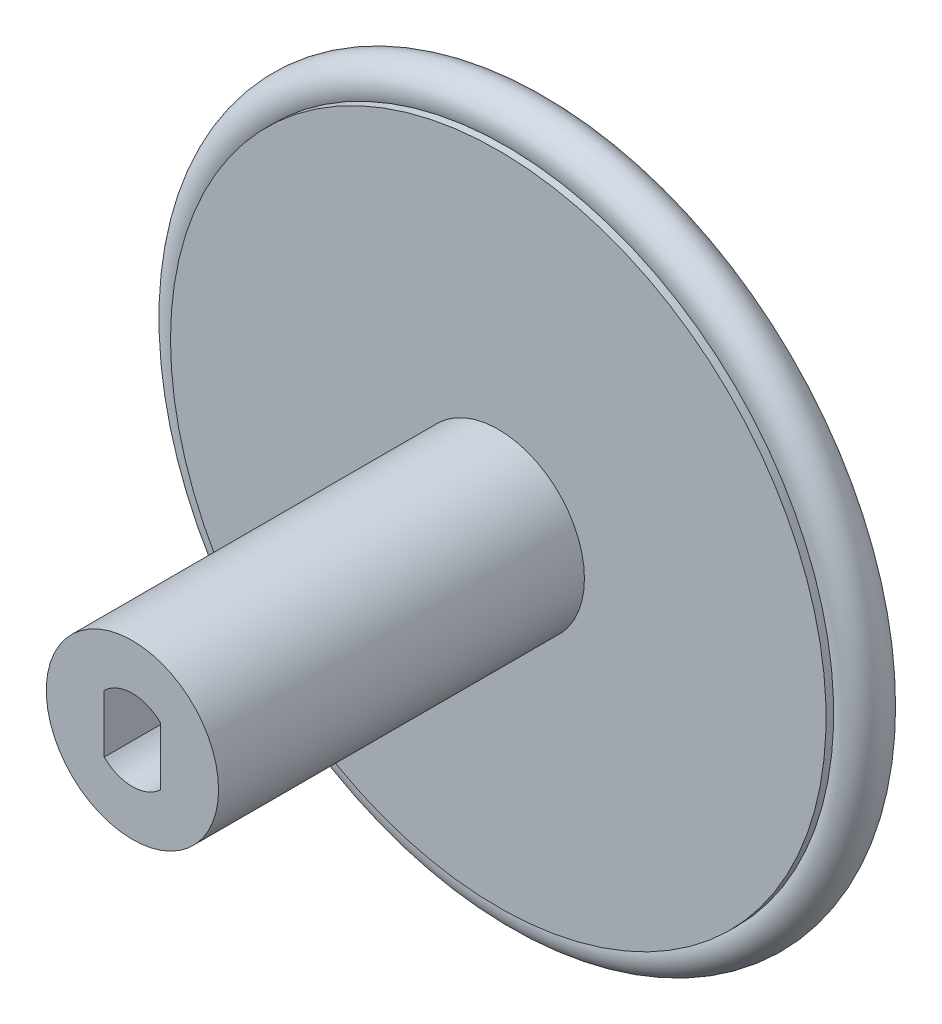
ISO-10303-21;
HEADER;
FILE_DESCRIPTION(('STEP AP214'),'2;1');
FILE_NAME('part.step','',(''),(''),'','','');
FILE_SCHEMA(('AUTOMOTIVE_DESIGN { 1 0 10303 214 1 1 1 1 }'));
ENDSEC;
DATA;
#1=APPLICATION_CONTEXT('core data for automotive mechanical design processes');
#2=APPLICATION_PROTOCOL_DEFINITION('international standard','automotive_design',2000,#1);
#3=PRODUCT_CONTEXT('',#1,'mechanical');
#4=PRODUCT('Part','Part','',(#3));
#5=PRODUCT_RELATED_PRODUCT_CATEGORY('part','',(#4));
#6=PRODUCT_DEFINITION_FORMATION('','',#4);
#7=PRODUCT_DEFINITION_CONTEXT('part definition',#1,'design');
#8=PRODUCT_DEFINITION('design','',#6,#7);
#9=PRODUCT_DEFINITION_SHAPE('','',#8);
#10=(LENGTH_UNIT() NAMED_UNIT(*) SI_UNIT(.MILLI.,.METRE.));
#11=(NAMED_UNIT(*) PLANE_ANGLE_UNIT() SI_UNIT($,.RADIAN.));
#12=(NAMED_UNIT(*) SI_UNIT($,.STERADIAN.) SOLID_ANGLE_UNIT());
#13=UNCERTAINTY_MEASURE_WITH_UNIT(LENGTH_MEASURE(1.E-05),#10,'distance_accuracy_value','');
#14=(GEOMETRIC_REPRESENTATION_CONTEXT(3) GLOBAL_UNCERTAINTY_ASSIGNED_CONTEXT((#13)) GLOBAL_UNIT_ASSIGNED_CONTEXT((#10,
#11,#12)) REPRESENTATION_CONTEXT('',''));
#15=CARTESIAN_POINT('',(0.,0.,0.));
#16=DIRECTION('',(0.,0.,1.));
#17=DIRECTION('',(1.,0.,0.));
#18=AXIS2_PLACEMENT_3D('',#15,#16,#17);
#19=CARTESIAN_POINT('',(0.,0.,0.));
#20=DIRECTION('',(0.,0.,1.));
#21=DIRECTION('',(1.,0.,0.));
#22=AXIS2_PLACEMENT_3D('',#19,#20,#21);
#23=TOROIDAL_SURFACE('',#22,22.039552593733,1.5);
#24=CARTESIAN_POINT('',(23.539552593733,0.,0.));
#25=VERTEX_POINT('',#24);
#26=VERTEX_LOOP('',#25);
#27=FACE_BOUND('',#26,.T.);
#28=ADVANCED_FACE('F44',(#27),#23,.T.);
#29=CLOSED_SHELL('',(#28));
#30=MANIFOLD_SOLID_BREP('B2_NOT_SHOWN',#29);
#31=CARTESIAN_POINT('',(0.,0.,-1.90000000000001));
#32=DIRECTION('',(0.,0.,-1.));
#33=DIRECTION('',(-1.,0.,0.));
#34=AXIS2_PLACEMENT_3D('',#31,#32,#33);
#35=PLANE('',#34);
#36=CARTESIAN_POINT('',(0.,0.,-1.90000000000001));
#37=DIRECTION('',(0.,0.,-1.));
#38=DIRECTION('',(-1.,0.,0.));
#39=AXIS2_PLACEMENT_3D('',#36,#37,#38);
#40=CIRCLE('',#39,21.5);
#41=CARTESIAN_POINT('',(-21.5,0.,-1.90000000000001));
#42=VERTEX_POINT('',#41);
#43=EDGE_CURVE('E59',#42,#42,#40,.T.);
#44=ORIENTED_EDGE('',*,*,#43,.T.);
#45=EDGE_LOOP('',(#44));
#46=FACE_BOUND('',#45,.T.);
#47=ADVANCED_FACE('F56',(#46),#35,.T.);
#48=CARTESIAN_POINT('',(0.,0.,-6.22705657946134));
#49=DIRECTION('',(0.,0.,-1.));
#50=DIRECTION('',(-1.,0.,0.));
#51=AXIS2_PLACEMENT_3D('',#48,#49,#50);
#52=CYLINDRICAL_SURFACE('',#51,21.5);
#53=CARTESIAN_POINT('',(0.,0.,-1.40000000000001));
#54=DIRECTION('',(0.,0.,-1.));
#55=DIRECTION('',(-1.,0.,0.));
#56=AXIS2_PLACEMENT_3D('',#53,#54,#55);
#57=CIRCLE('',#56,21.5);
#58=CARTESIAN_POINT('',(-21.5,0.,-1.40000000000001));
#59=VERTEX_POINT('',#58);
#60=EDGE_CURVE('E147',#59,#59,#57,.T.);
#61=ORIENTED_EDGE('',*,*,#60,.T.);
#62=EDGE_LOOP('',(#61));
#63=FACE_BOUND('',#62,.T.);
#64=ORIENTED_EDGE('',*,*,#43,.F.);
#65=EDGE_LOOP('',(#64));
#66=FACE_BOUND('',#65,.T.);
#67=ADVANCED_FACE('F155',(#63,#66),#52,.T.);
#68=CARTESIAN_POINT('',(0.,0.,-1.40000000000001));
#69=DIRECTION('',(0.,0.,-1.));
#70=DIRECTION('',(-1.,0.,0.));
#71=AXIS2_PLACEMENT_3D('',#68,#69,#70);
#72=CONICAL_SURFACE('',#71,21.5,1.22522113490003);
#73=CARTESIAN_POINT('',(0.,0.,-0.500000000000015));
#74=DIRECTION('',(0.,0.,-1.));
#75=DIRECTION('',(-1.,0.,0.));
#76=AXIS2_PLACEMENT_3D('',#73,#74,#75);
#77=CIRCLE('',#76,19.0001538314765);
#78=CARTESIAN_POINT('',(-19.0001538314765,0.,-0.500000000000015));
#79=VERTEX_POINT('',#78);
#80=EDGE_CURVE('E145',#79,#79,#77,.T.);
#81=ORIENTED_EDGE('',*,*,#80,.T.);
#82=EDGE_LOOP('',(#81));
#83=FACE_BOUND('',#82,.T.);
#84=ORIENTED_EDGE('',*,*,#60,.F.);
#85=EDGE_LOOP('',(#84));
#86=FACE_BOUND('',#85,.T.);
#87=ADVANCED_FACE('F157',(#83,#86),#72,.T.);
#88=CARTESIAN_POINT('',(0.,0.,-6.22705657946134));
#89=DIRECTION('',(0.,0.,-1.));
#90=DIRECTION('',(-1.,0.,0.));
#91=AXIS2_PLACEMENT_3D('',#88,#89,#90);
#92=CYLINDRICAL_SURFACE('',#91,19.0001538314765);
#93=CARTESIAN_POINT('',(0.,0.,0.500000000000007));
#94=DIRECTION('',(0.,0.,-1.));
#95=DIRECTION('',(-1.,0.,0.));
#96=AXIS2_PLACEMENT_3D('',#93,#94,#95);
#97=CIRCLE('',#96,19.0001538314765);
#98=CARTESIAN_POINT('',(-19.0001538314765,0.,0.500000000000007));
#99=VERTEX_POINT('',#98);
#100=EDGE_CURVE('E142',#99,#99,#97,.T.);
#101=ORIENTED_EDGE('',*,*,#100,.T.);
#102=EDGE_LOOP('',(#101));
#103=FACE_BOUND('',#102,.T.);
#104=ORIENTED_EDGE('',*,*,#80,.F.);
#105=EDGE_LOOP('',(#104));
#106=FACE_BOUND('',#105,.T.);
#107=ADVANCED_FACE('F162',(#103,#106),#92,.T.);
#108=CARTESIAN_POINT('',(0.,0.,0.500000000000007));
#109=DIRECTION('',(0.,0.,1.));
#110=DIRECTION('',(1.,0.,0.));
#111=AXIS2_PLACEMENT_3D('',#108,#109,#110);
#112=CONICAL_SURFACE('',#111,19.0001538314765,1.22522113490003);
#113=CARTESIAN_POINT('',(0.,0.,1.4));
#114=DIRECTION('',(0.,0.,-1.));
#115=DIRECTION('',(-1.,0.,0.));
#116=AXIS2_PLACEMENT_3D('',#113,#114,#115);
#117=CIRCLE('',#116,21.5);
#118=CARTESIAN_POINT('',(-21.5,0.,1.4));
#119=VERTEX_POINT('',#118);
#120=EDGE_CURVE('E139',#119,#119,#117,.T.);
#121=ORIENTED_EDGE('',*,*,#120,.T.);
#122=EDGE_LOOP('',(#121));
#123=FACE_BOUND('',#122,.T.);
#124=ORIENTED_EDGE('',*,*,#100,.F.);
#125=EDGE_LOOP('',(#124));
#126=FACE_BOUND('',#125,.T.);
#127=ADVANCED_FACE('F168',(#123,#126),#112,.T.);
#128=CARTESIAN_POINT('',(0.,0.,-6.22705657946134));
#129=DIRECTION('',(0.,0.,-1.));
#130=DIRECTION('',(-1.,0.,0.));
#131=AXIS2_PLACEMENT_3D('',#128,#129,#130);
#132=CYLINDRICAL_SURFACE('',#131,21.5);
#133=CARTESIAN_POINT('',(0.,0.,1.9));
#134=DIRECTION('',(0.,0.,-1.));
#135=DIRECTION('',(-1.,0.,0.));
#136=AXIS2_PLACEMENT_3D('',#133,#134,#135);
#137=CIRCLE('',#136,21.5);
#138=CARTESIAN_POINT('',(-21.5,0.,1.9));
#139=VERTEX_POINT('',#138);
#140=EDGE_CURVE('E135',#139,#139,#137,.T.);
#141=ORIENTED_EDGE('',*,*,#140,.T.);
#142=EDGE_LOOP('',(#141));
#143=FACE_BOUND('',#142,.T.);
#144=ORIENTED_EDGE('',*,*,#120,.F.);
#145=EDGE_LOOP('',(#144));
#146=FACE_BOUND('',#145,.T.);
#147=ADVANCED_FACE('F172',(#143,#146),#132,.T.);
#148=CARTESIAN_POINT('',(0.,0.,1.9));
#149=DIRECTION('',(0.,0.,1.));
#150=DIRECTION('',(1.,0.,0.));
#151=AXIS2_PLACEMENT_3D('',#148,#149,#150);
#152=PLANE('',#151);
#153=CARTESIAN_POINT('',(0.,0.,1.9));
#154=DIRECTION('',(0.,0.,1.));
#155=DIRECTION('',(1.,0.,0.));
#156=AXIS2_PLACEMENT_3D('',#153,#154,#155);
#157=CIRCLE('',#156,5.65);
#158=CARTESIAN_POINT('',(5.65,0.,1.9));
#159=VERTEX_POINT('',#158);
#160=EDGE_CURVE('E42',#159,#159,#157,.T.);
#161=ORIENTED_EDGE('',*,*,#160,.F.);
#162=EDGE_LOOP('',(#161));
#163=FACE_BOUND('',#162,.T.);
#164=ORIENTED_EDGE('',*,*,#140,.F.);
#165=EDGE_LOOP('',(#164));
#166=FACE_BOUND('',#165,.T.);
#167=ADVANCED_FACE('F176',(#163,#166),#152,.T.);
#168=CARTESIAN_POINT('',(0.,0.,25.9));
#169=DIRECTION('',(0.,0.,1.));
#170=DIRECTION('',(1.,0.,0.));
#171=AXIS2_PLACEMENT_3D('',#168,#169,#170);
#172=PLANE('',#171);
#173=CARTESIAN_POINT('',(0.,0.,25.9));
#174=DIRECTION('',(0.,0.,1.));
#175=DIRECTION('',(1.,0.,0.));
#176=AXIS2_PLACEMENT_3D('',#173,#174,#175);
#177=CIRCLE('',#176,5.65);
#178=CARTESIAN_POINT('',(5.65,0.,25.9));
#179=VERTEX_POINT('',#178);
#180=EDGE_CURVE('E133',#179,#179,#177,.T.);
#181=ORIENTED_EDGE('',*,*,#180,.T.);
#182=EDGE_LOOP('',(#181));
#183=FACE_BOUND('',#182,.T.);
#184=DIRECTION('',(0.,1.,0.));
#185=VECTOR('',#184,1.);
#186=CARTESIAN_POINT('',(1.85,1.89736659610103,25.9));
#187=LINE('',#186,#185);
#188=CARTESIAN_POINT('',(1.85,-1.89736659610103,25.9));
#189=VERTEX_POINT('',#188);
#190=CARTESIAN_POINT('',(1.85,1.89736659610103,25.9));
#191=VERTEX_POINT('',#190);
#192=EDGE_CURVE('E123',#189,#191,#187,.T.);
#193=ORIENTED_EDGE('',*,*,#192,.F.);
#194=CARTESIAN_POINT('',(0.,0.,25.9));
#195=DIRECTION('',(0.,0.,1.));
#196=DIRECTION('',(1.,0.,0.));
#197=AXIS2_PLACEMENT_3D('',#194,#195,#196);
#198=CIRCLE('',#197,2.65000000000001);
#199=CARTESIAN_POINT('',(-1.85,-1.89736659610103,25.9));
#200=VERTEX_POINT('',#199);
#201=EDGE_CURVE('E120',#200,#189,#198,.T.);
#202=ORIENTED_EDGE('',*,*,#201,.F.);
#203=DIRECTION('',(0.,-1.,0.));
#204=VECTOR('',#203,1.);
#205=CARTESIAN_POINT('',(-1.85,1.89736659610103,25.9));
#206=LINE('',#205,#204);
#207=CARTESIAN_POINT('',(-1.85,1.89736659610103,25.9));
#208=VERTEX_POINT('',#207);
#209=EDGE_CURVE('E105',#208,#200,#206,.T.);
#210=ORIENTED_EDGE('',*,*,#209,.F.);
#211=CARTESIAN_POINT('',(0.,0.,25.9));
#212=DIRECTION('',(0.,0.,1.));
#213=DIRECTION('',(-1.,0.,0.));
#214=AXIS2_PLACEMENT_3D('',#211,#212,#213);
#215=CIRCLE('',#214,2.65);
#216=EDGE_CURVE('E125',#191,#208,#215,.T.);
#217=ORIENTED_EDGE('',*,*,#216,.F.);
#218=EDGE_LOOP('',(#193,#202,#210,#217));
#219=FACE_BOUND('',#218,.T.);
#220=ADVANCED_FACE('F180',(#183,#219),#172,.T.);
#221=CARTESIAN_POINT('',(0.,0.,25.9));
#222=DIRECTION('',(0.,0.,-1.));
#223=DIRECTION('',(-1.,0.,0.));
#224=AXIS2_PLACEMENT_3D('',#221,#222,#223);
#225=CYLINDRICAL_SURFACE('',#224,5.65);
#226=ORIENTED_EDGE('',*,*,#180,.F.);
#227=EDGE_LOOP('',(#226));
#228=FACE_BOUND('',#227,.T.);
#229=ORIENTED_EDGE('',*,*,#160,.T.);
#230=EDGE_LOOP('',(#229));
#231=FACE_BOUND('',#230,.T.);
#232=ADVANCED_FACE('F182',(#228,#231),#225,.T.);
#233=CARTESIAN_POINT('',(0.,0.,25.9));
#234=DIRECTION('',(0.,0.,-1.));
#235=DIRECTION('',(-1.,0.,0.));
#236=AXIS2_PLACEMENT_3D('',#233,#234,#235);
#237=CYLINDRICAL_SURFACE('',#236,2.65000000000001);
#238=CARTESIAN_POINT('',(0.,0.,20.9));
#239=DIRECTION('',(0.,0.,1.));
#240=DIRECTION('',(1.,0.,0.));
#241=AXIS2_PLACEMENT_3D('',#238,#239,#240);
#242=CIRCLE('',#241,2.65000000000001);
#243=CARTESIAN_POINT('',(-1.85,-1.89736659610103,20.9));
#244=VERTEX_POINT('',#243);
#245=CARTESIAN_POINT('',(1.85,-1.89736659610103,20.9));
#246=VERTEX_POINT('',#245);
#247=EDGE_CURVE('E111',#244,#246,#242,.T.);
#248=ORIENTED_EDGE('',*,*,#247,.F.);
#249=DIRECTION('',(0.,0.,-1.));
#250=VECTOR('',#249,1.);
#251=CARTESIAN_POINT('',(-1.85,-1.89736659610103,25.9));
#252=LINE('',#251,#250);
#253=EDGE_CURVE('E99',#200,#244,#252,.T.);
#254=ORIENTED_EDGE('',*,*,#253,.F.);
#255=ORIENTED_EDGE('',*,*,#201,.T.);
#256=DIRECTION('',(0.,0.,-1.));
#257=VECTOR('',#256,1.);
#258=CARTESIAN_POINT('',(1.85,-1.89736659610103,25.9));
#259=LINE('',#258,#257);
#260=EDGE_CURVE('E113',#189,#246,#259,.T.);
#261=ORIENTED_EDGE('',*,*,#260,.T.);
#262=EDGE_LOOP('',(#248,#254,#255,#261));
#263=FACE_BOUND('',#262,.T.);
#264=ADVANCED_FACE('F112',(#263),#237,.F.);
#265=CARTESIAN_POINT('',(1.85,1.89736659610103,25.9));
#266=DIRECTION('',(-1.,0.,0.));
#267=DIRECTION('',(0.,0.,1.));
#268=AXIS2_PLACEMENT_3D('',#265,#266,#267);
#269=PLANE('',#268);
#270=DIRECTION('',(0.,1.,0.));
#271=VECTOR('',#270,1.);
#272=CARTESIAN_POINT('',(1.85,-1.89736659610103,20.9));
#273=LINE('',#272,#271);
#274=CARTESIAN_POINT('',(1.85,1.89736659610103,20.9));
#275=VERTEX_POINT('',#274);
#276=EDGE_CURVE('E71',#246,#275,#273,.T.);
#277=ORIENTED_EDGE('',*,*,#276,.F.);
#278=ORIENTED_EDGE('',*,*,#260,.F.);
#279=ORIENTED_EDGE('',*,*,#192,.T.);
#280=DIRECTION('',(0.,0.,-1.));
#281=VECTOR('',#280,1.);
#282=CARTESIAN_POINT('',(1.85,1.89736659610103,25.9));
#283=LINE('',#282,#281);
#284=EDGE_CURVE('E130',#191,#275,#283,.T.);
#285=ORIENTED_EDGE('',*,*,#284,.T.);
#286=EDGE_LOOP('',(#277,#278,#279,#285));
#287=FACE_BOUND('',#286,.T.);
#288=ADVANCED_FACE('F191',(#287),#269,.T.);
#289=CARTESIAN_POINT('',(0.,0.,25.9));
#290=DIRECTION('',(0.,0.,-1.));
#291=DIRECTION('',(-1.,0.,0.));
#292=AXIS2_PLACEMENT_3D('',#289,#290,#291);
#293=CYLINDRICAL_SURFACE('',#292,2.65);
#294=CARTESIAN_POINT('',(0.,0.,20.9));
#295=DIRECTION('',(0.,0.,1.));
#296=DIRECTION('',(1.,0.,0.));
#297=AXIS2_PLACEMENT_3D('',#294,#295,#296);
#298=CIRCLE('',#297,2.65);
#299=CARTESIAN_POINT('',(-1.85,1.89736659610103,20.9));
#300=VERTEX_POINT('',#299);
#301=EDGE_CURVE('E79',#275,#300,#298,.T.);
#302=ORIENTED_EDGE('',*,*,#301,.F.);
#303=ORIENTED_EDGE('',*,*,#284,.F.);
#304=ORIENTED_EDGE('',*,*,#216,.T.);
#305=DIRECTION('',(0.,0.,-1.));
#306=VECTOR('',#305,1.);
#307=CARTESIAN_POINT('',(-1.85,1.89736659610103,25.9));
#308=LINE('',#307,#306);
#309=EDGE_CURVE('E108',#208,#300,#308,.T.);
#310=ORIENTED_EDGE('',*,*,#309,.T.);
#311=EDGE_LOOP('',(#302,#303,#304,#310));
#312=FACE_BOUND('',#311,.T.);
#313=ADVANCED_FACE('F194',(#312),#293,.F.);
#314=CARTESIAN_POINT('',(-1.85,1.89736659610103,25.9));
#315=DIRECTION('',(1.,0.,0.));
#316=DIRECTION('',(0.,0.,-1.));
#317=AXIS2_PLACEMENT_3D('',#314,#315,#316);
#318=PLANE('',#317);
#319=DIRECTION('',(0.,-1.,0.));
#320=VECTOR('',#319,1.);
#321=CARTESIAN_POINT('',(-1.85,1.89736659610103,20.9));
#322=LINE('',#321,#320);
#323=EDGE_CURVE('E103',#300,#244,#322,.T.);
#324=ORIENTED_EDGE('',*,*,#323,.F.);
#325=ORIENTED_EDGE('',*,*,#309,.F.);
#326=ORIENTED_EDGE('',*,*,#209,.T.);
#327=ORIENTED_EDGE('',*,*,#253,.T.);
#328=EDGE_LOOP('',(#324,#325,#326,#327));
#329=FACE_BOUND('',#328,.T.);
#330=ADVANCED_FACE('F101',(#329),#318,.T.);
#331=CARTESIAN_POINT('',(0.,0.,20.9));
#332=DIRECTION('',(0.,0.,1.));
#333=DIRECTION('',(1.,0.,0.));
#334=AXIS2_PLACEMENT_3D('',#331,#332,#333);
#335=PLANE('',#334);
#336=ORIENTED_EDGE('',*,*,#301,.T.);
#337=ORIENTED_EDGE('',*,*,#323,.T.);
#338=ORIENTED_EDGE('',*,*,#247,.T.);
#339=ORIENTED_EDGE('',*,*,#276,.T.);
#340=EDGE_LOOP('',(#336,#337,#338,#339));
#341=FACE_BOUND('',#340,.T.);
#342=ADVANCED_FACE('F116',(#341),#335,.T.);
#343=CLOSED_SHELL('',(#47,#67,#87,#107,#127,#147,#167,#220,#232,#264,#288,#313,#330,#342));
#344=MANIFOLD_SOLID_BREP('B6',#343);
#345=ADVANCED_BREP_SHAPE_REPRESENTATION('',(#18,#30,#344),#14);
#346=SHAPE_DEFINITION_REPRESENTATION(#9,#345);
ENDSEC;
END-ISO-10303-21;
